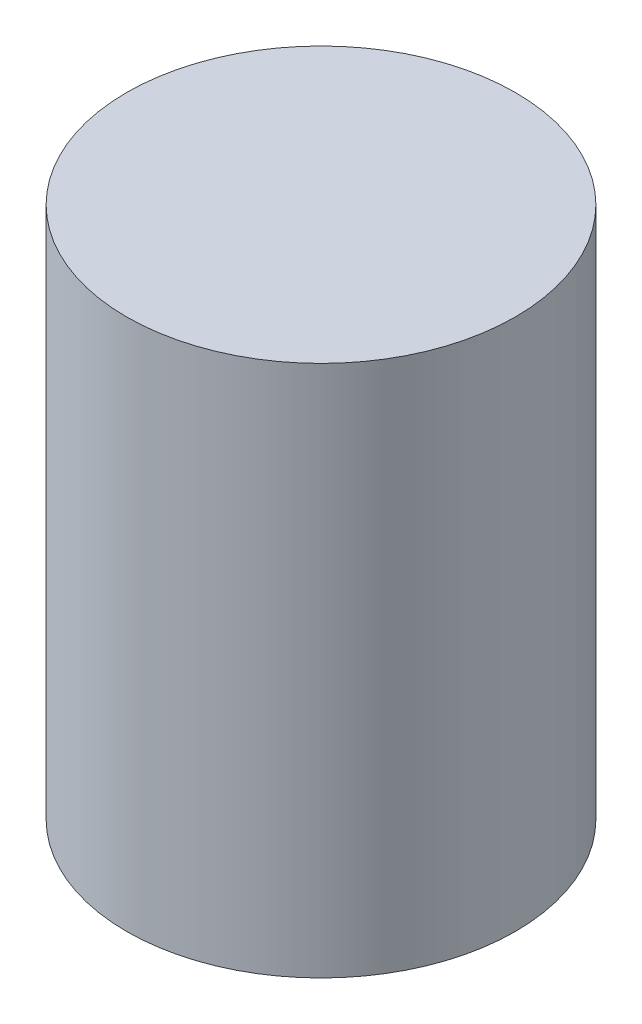
ISO-10303-21;
HEADER;
FILE_DESCRIPTION(('STEP AP214'),'2;1');
FILE_NAME('part.step','',(''),(''),'','','');
FILE_SCHEMA(('AUTOMOTIVE_DESIGN { 1 0 10303 214 1 1 1 1 }'));
ENDSEC;
DATA;
#1=APPLICATION_CONTEXT('core data for automotive mechanical design processes');
#2=APPLICATION_PROTOCOL_DEFINITION('international standard','automotive_design',2000,#1);
#3=PRODUCT_CONTEXT('',#1,'mechanical');
#4=PRODUCT('Part','Part','',(#3));
#5=PRODUCT_RELATED_PRODUCT_CATEGORY('part','',(#4));
#6=PRODUCT_DEFINITION_FORMATION('','',#4);
#7=PRODUCT_DEFINITION_CONTEXT('part definition',#1,'design');
#8=PRODUCT_DEFINITION('design','',#6,#7);
#9=PRODUCT_DEFINITION_SHAPE('','',#8);
#10=(LENGTH_UNIT() NAMED_UNIT(*) SI_UNIT(.MILLI.,.METRE.));
#11=(NAMED_UNIT(*) PLANE_ANGLE_UNIT() SI_UNIT($,.RADIAN.));
#12=(NAMED_UNIT(*) SI_UNIT($,.STERADIAN.) SOLID_ANGLE_UNIT());
#13=UNCERTAINTY_MEASURE_WITH_UNIT(LENGTH_MEASURE(1.E-05),#10,'distance_accuracy_value','');
#14=(GEOMETRIC_REPRESENTATION_CONTEXT(3) GLOBAL_UNCERTAINTY_ASSIGNED_CONTEXT((#13)) GLOBAL_UNIT_ASSIGNED_CONTEXT((#10,
#11,#12)) REPRESENTATION_CONTEXT('',''));
#15=CARTESIAN_POINT('',(0.,0.,0.));
#16=DIRECTION('',(0.,0.,1.));
#17=DIRECTION('',(1.,0.,0.));
#18=AXIS2_PLACEMENT_3D('',#15,#16,#17);
#19=CARTESIAN_POINT('',(0.,15.06,0.));
#20=DIRECTION('',(0.,-1.,0.));
#21=DIRECTION('',(0.,0.,-1.));
#22=AXIS2_PLACEMENT_3D('',#19,#20,#21);
#23=CYLINDRICAL_SURFACE('',#22,5.5);
#24=CARTESIAN_POINT('',(0.,15.06,0.));
#25=DIRECTION('',(0.,1.,0.));
#26=DIRECTION('',(0.,0.,1.));
#27=AXIS2_PLACEMENT_3D('',#24,#25,#26);
#28=CIRCLE('',#27,5.5);
#29=CARTESIAN_POINT('',(0.,15.06,5.5));
#30=VERTEX_POINT('',#29);
#31=EDGE_CURVE('E10',#30,#30,#28,.T.);
#32=ORIENTED_EDGE('',*,*,#31,.F.);
#33=EDGE_LOOP('',(#32));
#34=FACE_BOUND('',#33,.T.);
#35=CARTESIAN_POINT('',(0.,0.,0.));
#36=DIRECTION('',(0.,1.,0.));
#37=DIRECTION('',(0.,0.,1.));
#38=AXIS2_PLACEMENT_3D('',#35,#36,#37);
#39=CIRCLE('',#38,5.5);
#40=CARTESIAN_POINT('',(0.,0.,5.5));
#41=VERTEX_POINT('',#40);
#42=EDGE_CURVE('E46',#41,#41,#39,.T.);
#43=ORIENTED_EDGE('',*,*,#42,.T.);
#44=EDGE_LOOP('',(#43));
#45=FACE_BOUND('',#44,.T.);
#46=ADVANCED_FACE('F43',(#34,#45),#23,.T.);
#47=CARTESIAN_POINT('',(0.,15.06,0.));
#48=DIRECTION('',(0.,1.,0.));
#49=DIRECTION('',(0.,0.,1.));
#50=AXIS2_PLACEMENT_3D('',#47,#48,#49);
#51=PLANE('',#50);
#52=ORIENTED_EDGE('',*,*,#31,.T.);
#53=EDGE_LOOP('',(#52));
#54=FACE_BOUND('',#53,.T.);
#55=ADVANCED_FACE('F60',(#54),#51,.T.);
#56=CARTESIAN_POINT('',(0.,0.,0.));
#57=DIRECTION('',(0.,1.,0.));
#58=DIRECTION('',(0.,0.,1.));
#59=AXIS2_PLACEMENT_3D('',#56,#57,#58);
#60=PLANE('',#59);
#61=ORIENTED_EDGE('',*,*,#42,.F.);
#62=EDGE_LOOP('',(#61));
#63=FACE_BOUND('',#62,.T.);
#64=ADVANCED_FACE('F58',(#63),#60,.F.);
#65=CLOSED_SHELL('',(#46,#55,#64));
#66=MANIFOLD_SOLID_BREP('B2',#65);
#67=ADVANCED_BREP_SHAPE_REPRESENTATION('',(#18,#66),#14);
#68=SHAPE_DEFINITION_REPRESENTATION(#9,#67);
ENDSEC;
END-ISO-10303-21;
